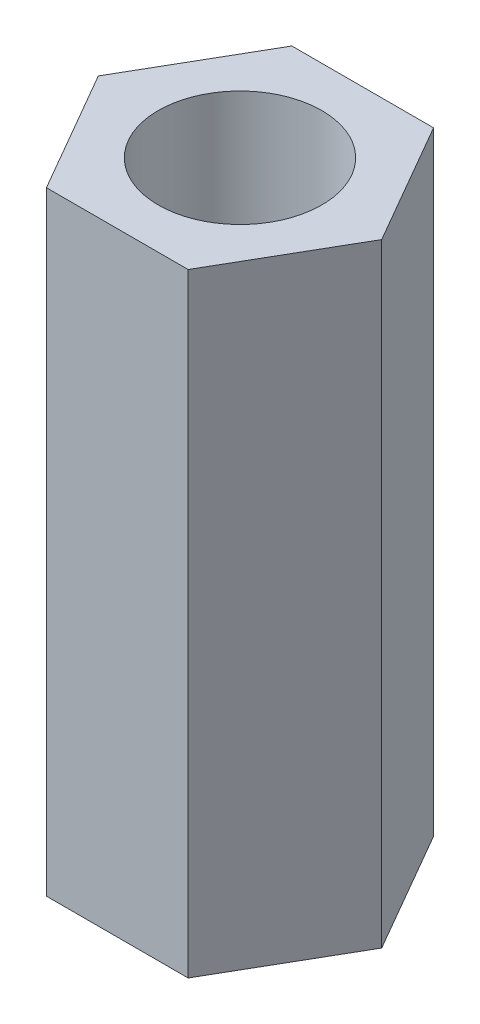
ISO-10303-21;
HEADER;
FILE_DESCRIPTION(('STEP AP214'),'2;1');
FILE_NAME('part.step','',(''),(''),'','','');
FILE_SCHEMA(('AUTOMOTIVE_DESIGN { 1 0 10303 214 1 1 1 1 }'));
ENDSEC;
DATA;
#1=APPLICATION_CONTEXT('core data for automotive mechanical design processes');
#2=APPLICATION_PROTOCOL_DEFINITION('international standard','automotive_design',2000,#1);
#3=PRODUCT_CONTEXT('',#1,'mechanical');
#4=PRODUCT('Part','Part','',(#3));
#5=PRODUCT_RELATED_PRODUCT_CATEGORY('part','',(#4));
#6=PRODUCT_DEFINITION_FORMATION('','',#4);
#7=PRODUCT_DEFINITION_CONTEXT('part definition',#1,'design');
#8=PRODUCT_DEFINITION('design','',#6,#7);
#9=PRODUCT_DEFINITION_SHAPE('','',#8);
#10=(LENGTH_UNIT() NAMED_UNIT(*) SI_UNIT(.MILLI.,.METRE.));
#11=(NAMED_UNIT(*) PLANE_ANGLE_UNIT() SI_UNIT($,.RADIAN.));
#12=(NAMED_UNIT(*) SI_UNIT($,.STERADIAN.) SOLID_ANGLE_UNIT());
#13=UNCERTAINTY_MEASURE_WITH_UNIT(LENGTH_MEASURE(1.E-05),#10,'distance_accuracy_value','');
#14=(GEOMETRIC_REPRESENTATION_CONTEXT(3) GLOBAL_UNCERTAINTY_ASSIGNED_CONTEXT((#13)) GLOBAL_UNIT_ASSIGNED_CONTEXT((#10,
#11,#12)) REPRESENTATION_CONTEXT('',''));
#15=CARTESIAN_POINT('',(0.,0.,0.));
#16=DIRECTION('',(0.,0.,1.));
#17=DIRECTION('',(1.,0.,0.));
#18=AXIS2_PLACEMENT_3D('',#15,#16,#17);
#19=CARTESIAN_POINT('',(1.732050808,0.,-3.));
#20=DIRECTION('',(-0.866025403855548,0.,0.499999999876834));
#21=DIRECTION('',(0.499999999876834,0.,0.866025403855548));
#22=AXIS2_PLACEMENT_3D('',#19,#20,#21);
#23=PLANE('',#22);
#24=DIRECTION('',(0.,1.,0.));
#25=VECTOR('',#24,1.);
#26=CARTESIAN_POINT('',(1.732050808,0.,-3.));
#27=LINE('',#26,#25);
#28=CARTESIAN_POINT('',(1.732050808,0.,-3.));
#29=VERTEX_POINT('',#28);
#30=CARTESIAN_POINT('',(1.732050808,15.,-3.));
#31=VERTEX_POINT('',#30);
#32=EDGE_CURVE('E22',#29,#31,#27,.T.);
#33=ORIENTED_EDGE('',*,*,#32,.T.);
#34=DIRECTION('',(-0.499999999876834,0.,-0.866025403855548));
#35=VECTOR('',#34,1.);
#36=CARTESIAN_POINT('',(3.46410161472361,15.,-4.78716025154036E-10));
#37=LINE('',#36,#35);
#38=CARTESIAN_POINT('',(3.464101615,15.,0.));
#39=VERTEX_POINT('',#38);
#40=EDGE_CURVE('E88',#39,#31,#37,.T.);
#41=ORIENTED_EDGE('',*,*,#40,.F.);
#42=DIRECTION('',(0.,1.,0.));
#43=VECTOR('',#42,1.);
#44=CARTESIAN_POINT('',(3.464101615,0.,0.));
#45=LINE('',#44,#43);
#46=CARTESIAN_POINT('',(3.464101615,0.,0.));
#47=VERTEX_POINT('',#46);
#48=EDGE_CURVE('E86',#39,#47,#45,.F.);
#49=ORIENTED_EDGE('',*,*,#48,.T.);
#50=DIRECTION('',(0.499999999876834,0.,0.866025403855548));
#51=VECTOR('',#50,1.);
#52=CARTESIAN_POINT('',(1.732050808,0.,-3.));
#53=LINE('',#52,#51);
#54=EDGE_CURVE('E73',#47,#29,#53,.F.);
#55=ORIENTED_EDGE('',*,*,#54,.T.);
#56=EDGE_LOOP('',(#33,#41,#49,#55));
#57=FACE_BOUND('',#56,.T.);
#58=ADVANCED_FACE('F17',(#57),#23,.F.);
#59=CARTESIAN_POINT('',(-1.732050808,0.,-3.));
#60=DIRECTION('',(0.,0.,1.));
#61=DIRECTION('',(1.,0.,0.));
#62=AXIS2_PLACEMENT_3D('',#59,#60,#61);
#63=PLANE('',#62);
#64=DIRECTION('',(0.,1.,0.));
#65=VECTOR('',#64,1.);
#66=CARTESIAN_POINT('',(-1.732050808,0.,-3.));
#67=LINE('',#66,#65);
#68=CARTESIAN_POINT('',(-1.732050808,0.,-3.));
#69=VERTEX_POINT('',#68);
#70=CARTESIAN_POINT('',(-1.732050808,15.,-3.));
#71=VERTEX_POINT('',#70);
#72=EDGE_CURVE('E145',#69,#71,#67,.T.);
#73=ORIENTED_EDGE('',*,*,#72,.T.);
#74=DIRECTION('',(1.,0.,0.));
#75=VECTOR('',#74,1.);
#76=CARTESIAN_POINT('',(-3.505670835,15.,-3.));
#77=LINE('',#76,#75);
#78=EDGE_CURVE('E129',#31,#71,#77,.F.);
#79=ORIENTED_EDGE('',*,*,#78,.F.);
#80=ORIENTED_EDGE('',*,*,#32,.F.);
#81=DIRECTION('',(1.,0.,0.));
#82=VECTOR('',#81,1.);
#83=CARTESIAN_POINT('',(-1.732050808,0.,-3.));
#84=LINE('',#83,#82);
#85=EDGE_CURVE('E79',#29,#69,#84,.F.);
#86=ORIENTED_EDGE('',*,*,#85,.T.);
#87=EDGE_LOOP('',(#73,#79,#80,#86));
#88=FACE_BOUND('',#87,.T.);
#89=ADVANCED_FACE('F155',(#88),#63,.F.);
#90=CARTESIAN_POINT('',(-3.464101615,0.,0.));
#91=DIRECTION('',(0.866025403855548,0.,0.499999999876834));
#92=DIRECTION('',(0.499999999876834,0.,-0.866025403855548));
#93=AXIS2_PLACEMENT_3D('',#90,#91,#92);
#94=PLANE('',#93);
#95=DIRECTION('',(0.,1.,0.));
#96=VECTOR('',#95,1.);
#97=CARTESIAN_POINT('',(-3.464101615,0.,0.));
#98=LINE('',#97,#96);
#99=CARTESIAN_POINT('',(-3.464101615,0.,0.));
#100=VERTEX_POINT('',#99);
#101=CARTESIAN_POINT('',(-3.464101615,15.,0.));
#102=VERTEX_POINT('',#101);
#103=EDGE_CURVE('E142',#100,#102,#98,.T.);
#104=ORIENTED_EDGE('',*,*,#103,.T.);
#105=DIRECTION('',(-0.499999999876834,0.,0.866025403855548));
#106=VECTOR('',#105,1.);
#107=CARTESIAN_POINT('',(-1.73205080773681,15.,-3.00000000045586));
#108=LINE('',#107,#106);
#109=EDGE_CURVE('E126',#71,#102,#108,.T.);
#110=ORIENTED_EDGE('',*,*,#109,.F.);
#111=ORIENTED_EDGE('',*,*,#72,.F.);
#112=DIRECTION('',(0.499999999876834,0.,-0.866025403855548));
#113=VECTOR('',#112,1.);
#114=CARTESIAN_POINT('',(-3.464101615,0.,0.));
#115=LINE('',#114,#113);
#116=EDGE_CURVE('E114',#69,#100,#115,.F.);
#117=ORIENTED_EDGE('',*,*,#116,.T.);
#118=EDGE_LOOP('',(#104,#110,#111,#117));
#119=FACE_BOUND('',#118,.T.);
#120=ADVANCED_FACE('F166',(#119),#94,.F.);
#121=CARTESIAN_POINT('',(-1.732050808,0.,3.));
#122=DIRECTION('',(0.866025403855548,0.,-0.499999999876834));
#123=DIRECTION('',(-0.499999999876834,0.,-0.866025403855548));
#124=AXIS2_PLACEMENT_3D('',#121,#122,#123);
#125=PLANE('',#124);
#126=DIRECTION('',(0.,1.,0.));
#127=VECTOR('',#126,1.);
#128=CARTESIAN_POINT('',(-1.732050808,0.,3.));
#129=LINE('',#128,#127);
#130=CARTESIAN_POINT('',(-1.732050808,0.,3.));
#131=VERTEX_POINT('',#130);
#132=CARTESIAN_POINT('',(-1.732050808,15.,3.));
#133=VERTEX_POINT('',#132);
#134=EDGE_CURVE('E138',#131,#133,#129,.T.);
#135=ORIENTED_EDGE('',*,*,#134,.T.);
#136=DIRECTION('',(0.499999999876834,0.,0.866025403855548));
#137=VECTOR('',#136,1.);
#138=CARTESIAN_POINT('',(-3.46410161472361,15.,4.78716025154036E-10));
#139=LINE('',#138,#137);
#140=EDGE_CURVE('E123',#102,#133,#139,.T.);
#141=ORIENTED_EDGE('',*,*,#140,.F.);
#142=ORIENTED_EDGE('',*,*,#103,.F.);
#143=DIRECTION('',(-0.499999999876834,0.,-0.866025403855548));
#144=VECTOR('',#143,1.);
#145=CARTESIAN_POINT('',(-1.732050808,0.,3.));
#146=LINE('',#145,#144);
#147=EDGE_CURVE('E104',#100,#131,#146,.F.);
#148=ORIENTED_EDGE('',*,*,#147,.T.);
#149=EDGE_LOOP('',(#135,#141,#142,#148));
#150=FACE_BOUND('',#149,.T.);
#151=ADVANCED_FACE('F164',(#150),#125,.F.);
#152=CARTESIAN_POINT('',(1.732050808,0.,3.));
#153=DIRECTION('',(0.,0.,-1.));
#154=DIRECTION('',(-1.,0.,0.));
#155=AXIS2_PLACEMENT_3D('',#152,#153,#154);
#156=PLANE('',#155);
#157=DIRECTION('',(0.,1.,0.));
#158=VECTOR('',#157,1.);
#159=CARTESIAN_POINT('',(1.732050808,0.,3.));
#160=LINE('',#159,#158);
#161=CARTESIAN_POINT('',(1.732050808,0.,3.));
#162=VERTEX_POINT('',#161);
#163=CARTESIAN_POINT('',(1.732050808,15.,3.));
#164=VERTEX_POINT('',#163);
#165=EDGE_CURVE('E38',#162,#164,#160,.T.);
#166=ORIENTED_EDGE('',*,*,#165,.T.);
#167=DIRECTION('',(1.,0.,0.));
#168=VECTOR('',#167,1.);
#169=CARTESIAN_POINT('',(-3.505670835,15.,3.));
#170=LINE('',#169,#168);
#171=EDGE_CURVE('E82',#133,#164,#170,.T.);
#172=ORIENTED_EDGE('',*,*,#171,.F.);
#173=ORIENTED_EDGE('',*,*,#134,.F.);
#174=DIRECTION('',(-1.,0.,0.));
#175=VECTOR('',#174,1.);
#176=CARTESIAN_POINT('',(1.732050808,0.,3.));
#177=LINE('',#176,#175);
#178=EDGE_CURVE('E95',#131,#162,#177,.F.);
#179=ORIENTED_EDGE('',*,*,#178,.T.);
#180=EDGE_LOOP('',(#166,#172,#173,#179));
#181=FACE_BOUND('',#180,.T.);
#182=ADVANCED_FACE('F161',(#181),#156,.F.);
#183=CARTESIAN_POINT('',(3.464101615,0.,0.));
#184=DIRECTION('',(-0.866025403855548,0.,-0.499999999876834));
#185=DIRECTION('',(-0.499999999876834,0.,0.866025403855548));
#186=AXIS2_PLACEMENT_3D('',#183,#184,#185);
#187=PLANE('',#186);
#188=ORIENTED_EDGE('',*,*,#48,.F.);
#189=DIRECTION('',(0.499999999876834,0.,-0.866025403855548));
#190=VECTOR('',#189,1.);
#191=CARTESIAN_POINT('',(1.73205080773681,15.,3.00000000045586));
#192=LINE('',#191,#190);
#193=EDGE_CURVE('E91',#164,#39,#192,.T.);
#194=ORIENTED_EDGE('',*,*,#193,.F.);
#195=ORIENTED_EDGE('',*,*,#165,.F.);
#196=DIRECTION('',(-0.499999999876834,0.,0.866025403855548));
#197=VECTOR('',#196,1.);
#198=CARTESIAN_POINT('',(3.464101615,0.,0.));
#199=LINE('',#198,#197);
#200=EDGE_CURVE('E76',#162,#47,#199,.F.);
#201=ORIENTED_EDGE('',*,*,#200,.T.);
#202=EDGE_LOOP('',(#188,#194,#195,#201));
#203=FACE_BOUND('',#202,.T.);
#204=ADVANCED_FACE('F93',(#203),#187,.F.);
#205=CARTESIAN_POINT('',(-3.505670835,15.,-3.));
#206=DIRECTION('',(0.,1.,0.));
#207=DIRECTION('',(0.,0.,1.));
#208=AXIS2_PLACEMENT_3D('',#205,#206,#207);
#209=PLANE('',#208);
#210=CARTESIAN_POINT('',(-1.19723388120618E-10,15.,-2.));
#211=CARTESIAN_POINT('',(-0.0561537282825787,15.,-1.99999966326123));
#212=CARTESIAN_POINT('',(-0.112317776617583,15.,-1.99763295356125));
#213=CARTESIAN_POINT('',(-0.224257742730536,15.,-1.98818150785587));
#214=CARTESIAN_POINT('',(-0.280033541006416,15.,-1.98109537894131));
#215=CARTESIAN_POINT('',(-0.390883816128431,15.,-1.96223695577142));
#216=CARTESIAN_POINT('',(-0.445957035799322,15.,-1.950457222763));
#217=CARTESIAN_POINT('',(-0.554945941310325,15.,-1.92229286464738));
#218=CARTESIAN_POINT('',(-0.608860649426699,15.,-1.90590450264052));
#219=CARTESIAN_POINT('',(-0.768058884950165,15.,-1.85005263952839));
#220=CARTESIAN_POINT('',(-0.871064439413996,15.,-1.80385648741787));
#221=CARTESIAN_POINT('',(-1.06784493792675,15.,-1.69480474605575));
#222=CARTESIAN_POINT('',(-1.16161953089511,15.,-1.63194852350822));
#223=CARTESIAN_POINT('',(-1.29332617529571,15.,-1.5265915317294));
#224=CARTESIAN_POINT('',(-1.33576066157836,15.,-1.48959927251656));
#225=CARTESIAN_POINT('',(-1.41732574908343,15.,-1.41221312952993));
#226=CARTESIAN_POINT('',(-1.45645949630214,15.,-1.37182255982206));
#227=CARTESIAN_POINT('',(-1.56856725646422,15.,-1.24587628298798));
#228=CARTESIAN_POINT('',(-1.63627627659007,15.,-1.15552317333004));
#229=CARTESIAN_POINT('',(-1.75552410747972,15.,-0.964781086284522));
#230=CARTESIAN_POINT('',(-1.80706352797462,15.,-0.864392487508325));
#231=CARTESIAN_POINT('',(-1.89256650045295,15.,-0.656376282856753));
#232=CARTESIAN_POINT('',(-1.92653024015285,15.,-0.5487487543104));
#233=CARTESIAN_POINT('',(-1.97590388958835,15.,-0.329321779905196));
#234=CARTESIAN_POINT('',(-1.9913137002381,15.,-0.217522311769704));
#235=CARTESIAN_POINT('',(-2.00314655628282,15.,0.00707692912882605));
#236=CARTESIAN_POINT('',(-1.99956960167778,15.,0.119876701891865));
#237=CARTESIAN_POINT('',(-1.97352600062362,15.,0.343276982105055));
#238=CARTESIAN_POINT('',(-1.95105945505258,15.,0.453877501296883));
#239=CARTESIAN_POINT('',(-1.88788753049189,15.,0.669726540320858));
#240=CARTESIAN_POINT('',(-1.84718195669945,15.,0.774975002976744));
#241=CARTESIAN_POINT('',(-1.7486368702934,15.,0.977191359603996));
#242=CARTESIAN_POINT('',(-1.69079671154076,15.,1.07415894112863));
#243=CARTESIAN_POINT('',(-1.59254362203355,15.,1.21118793418928));
#244=CARTESIAN_POINT('',(-1.55787063408007,15.,1.2554669608168));
#245=CARTESIAN_POINT('',(-1.48488858435554,15.,1.34099531309871));
#246=CARTESIAN_POINT('',(-1.44657604577215,15.,1.38224167360529));
#247=CARTESIAN_POINT('',(-1.32666911005668,15.,1.50085475325198));
#248=CARTESIAN_POINT('',(-1.24001838562408,15.,1.57321655916251));
#249=CARTESIAN_POINT('',(-1.05578607169728,15.,1.7023416976686));
#250=CARTESIAN_POINT('',(-0.9582048978849,15.,1.75910562316373));
#251=CARTESIAN_POINT('',(-0.805756713294285,15.,1.83137636289948));
#252=CARTESIAN_POINT('',(-0.753862511343682,15.,1.8533391943305));
#253=CARTESIAN_POINT('',(-0.648436383581057,15.,1.89279986053878));
#254=CARTESIAN_POINT('',(-0.594905822742257,15.,1.91030130879231));
#255=CARTESIAN_POINT('',(-0.486650790341392,15.,1.94070314391751));
#256=CARTESIAN_POINT('',(-0.431928350636566,15.,1.95361079626189));
#257=CARTESIAN_POINT('',(-0.321601203035078,15.,1.97477223150026));
#258=CARTESIAN_POINT('',(-0.265996760341601,15.,1.98302738703549));
#259=CARTESIAN_POINT('',(-0.175255113092285,15.,1.99261587204262));
#260=CARTESIAN_POINT('',(-0.140263192131721,15.,1.99538404364552));
#261=CARTESIAN_POINT('',(-0.0701821911749017,15.,1.99907621284032));
#262=CARTESIAN_POINT('',(-0.0350931111786462,15.,2.00000021043223));
#263=CARTESIAN_POINT('',(0.0561537276156468,15.,1.99999966327995));
#264=CARTESIAN_POINT('',(0.112317775951283,15.,1.99763295359871));
#265=CARTESIAN_POINT('',(0.224257742067113,15.,1.9881815079307));
#266=CARTESIAN_POINT('',(0.280033540345237,15.,1.98109537903477));
#267=CARTESIAN_POINT('',(0.390883815473597,15.,1.96223695590187));
#268=CARTESIAN_POINT('',(0.445957035148587,15.,1.95045722291179));
#269=CARTESIAN_POINT('',(0.554945940669289,15.,1.92229286483244));
#270=CARTESIAN_POINT('',(0.608860648791264,15.,1.90590450284352));
#271=CARTESIAN_POINT('',(0.768058884333474,15.,1.85005263978441));
#272=CARTESIAN_POINT('',(0.871064438812698,15.,1.80385648770824));
#273=CARTESIAN_POINT('',(1.0678449373618,15.,1.6948047464117));
#274=CARTESIAN_POINT('',(1.16161953035113,15.,1.63194852389543));
#275=CARTESIAN_POINT('',(1.29332617478684,15.,1.52659153216052));
#276=CARTESIAN_POINT('',(1.33576066108181,15.,1.48959927296182));
#277=CARTESIAN_POINT('',(1.41732574861266,15.,1.41221313000239));
#278=CARTESIAN_POINT('',(1.45645949584483,15.,1.37182256030757));
#279=CARTESIAN_POINT('',(1.5685672560489,15.,1.24587628351087));
#280=CARTESIAN_POINT('',(1.63627627620489,15.,1.15552317387548));
#281=CARTESIAN_POINT('',(1.75552410715813,15.,0.964781086869694));
#282=CARTESIAN_POINT('',(1.8070635276865,15.,0.864392488110673));
#283=CARTESIAN_POINT('',(1.89256650023416,15.,0.656376283487601));
#284=CARTESIAN_POINT('',(1.92653023996993,15.,0.548748754952573));
#285=CARTESIAN_POINT('',(1.97590388947858,15.,0.329321780563831));
#286=CARTESIAN_POINT('',(1.99131370016559,15.,0.217522312433477));
#287=CARTESIAN_POINT('',(2.00314655628517,15.,-0.00707692846110986));
#288=CARTESIAN_POINT('',(1.99956960171774,15.,-0.119876701225342));
#289=CARTESIAN_POINT('',(1.97352600073804,15.,-0.343276981447217));
#290=CARTESIAN_POINT('',(1.95105945520387,15.,-0.453877500646539));
#291=CARTESIAN_POINT('',(1.88788753071513,15.,-0.66972653969157));
#292=CARTESIAN_POINT('',(1.84718195695777,15.,-0.774975002361022));
#293=CARTESIAN_POINT('',(1.74863687061914,15.,-0.977191359021102));
#294=CARTESIAN_POINT('',(1.69079671189883,15.,-1.074158940565));
#295=CARTESIAN_POINT('',(1.5925436224373,15.,-1.21118793365839));
#296=CARTESIAN_POINT('',(1.55787063449858,15.,-1.25546696029749));
#297=CARTESIAN_POINT('',(1.48488858480255,15.,-1.34099531260374));
#298=CARTESIAN_POINT('',(1.4465760462329,15.,-1.38224167312309));
#299=CARTESIAN_POINT('',(1.32666911055697,15.,-1.50085475280975));
#300=CARTESIAN_POINT('',(1.24001838614849,15.,-1.57321655874916));
#301=CARTESIAN_POINT('',(1.05578607226473,15.,-1.70234169731666));
#302=CARTESIAN_POINT('',(0.958204898471274,15.,-1.75910562284432));
#303=CARTESIAN_POINT('',(0.805756713904871,15.,-1.83137636263083));
#304=CARTESIAN_POINT('',(0.753862511961722,15.,-1.8533391940791));
#305=CARTESIAN_POINT('',(0.648436384212554,15.,-1.89279986032244));
#306=CARTESIAN_POINT('',(0.594905823379758,15.,-1.91030130859377));
#307=CARTESIAN_POINT('',(0.48665079098909,15.,-1.9407031437551));
#308=CARTESIAN_POINT('',(0.431928351288452,15.,-1.95361079611776));
#309=CARTESIAN_POINT('',(0.321601203693752,15.,-1.974772231393));
#310=CARTESIAN_POINT('',(0.265996761002873,15.,-1.9830273869468));
#311=CARTESIAN_POINT('',(0.175255113535492,15.,-1.99261587200755));
#312=CARTESIAN_POINT('',(0.140263192353632,15.,-1.99538404363383));
#313=CARTESIAN_POINT('',(0.0701821909529897,15.,-1.99907621285201));
#314=CARTESIAN_POINT('',(0.0350931107342072,15.,-2.00000021044392));
#315=CARTESIAN_POINT('',(-1.19723388120618E-10,15.,-2.));
#316=B_SPLINE_CURVE_WITH_KNOTS('',3,(#210,#211,#212,#213,#214,#215,#216,#217,#218,#219,#220,
#221,#222,#223,#224,#225,#226,#227,#228,#229,#230,#231,#232,#233,#234,#235,#236,#237,#238,#239,
#240,#241,#242,#243,#244,#245,#246,#247,#248,#249,#250,#251,#252,#253,#254,#255,#256,#257,#258,
#259,#260,#261,#262,#263,#264,#265,#266,#267,#268,#269,#270,#271,#272,#273,#274,#275,#276,#277,
#278,#279,#280,#281,#282,#283,#284,#285,#286,#287,#288,#289,#290,#291,#292,#293,#294,#295,#296,
#297,#298,#299,#300,#301,#302,#303,#304,#305,#306,#307,#308,#309,#310,#311,#312,#313,#314,#315),
.UNSPECIFIED.,.T.,.F.,(4,2,2,2,2,2,2,2,2,2,2,2,2,2,2,2,2,2,2,2,2,2,2,2,2,2,2,2,2,2,2,2,2,2,2,2,
2,2,2,2,2,2,2,2,2,2,2,2,2,2,2,2,4),(0.,0.168428877456362,0.33690748775991,0.505654183695087,
0.674538104121825,1.01150089527945,1.34847649717352,1.51718508008366,1.68573100250976,
2.02271470724979,2.35968570331694,2.69665310030229,3.03362229682857,3.37059149335485,
3.70755889034019,4.04452988640734,4.38151359114743,4.5500595135735,4.71876809648362,
5.05574369837771,5.39270648953531,5.56159040996248,5.73033710589816,5.89881571620138,
6.06724459365714,6.17250373536567,6.2777628770742,6.44619175452996,6.61467036483318,
6.78341706076886,6.95230098119603,7.28926377235363,7.62623937424772,7.79494795715784,
7.96349387958391,8.300477584324,8.63744858039115,8.97441597737649,9.31138517390277,
9.64835437042905,9.9853217674144,10.3222927634815,10.6592764682216,10.8278223906477,
10.9965309735578,11.3335065754519,11.6704693666095,11.8393532870363,12.0080999829714,
12.176578593275,12.3450074707313,12.4502666131063,12.5555257554813),.UNSPECIFIED.);
#317=CARTESIAN_POINT('',(-1.19723388120618E-10,15.,-2.));
#318=VERTEX_POINT('',#317);
#319=EDGE_CURVE('E29',#318,#318,#316,.T.);
#320=ORIENTED_EDGE('',*,*,#319,.F.);
#321=EDGE_LOOP('',(#320));
#322=FACE_BOUND('',#321,.T.);
#323=ORIENTED_EDGE('',*,*,#140,.T.);
#324=ORIENTED_EDGE('',*,*,#171,.T.);
#325=ORIENTED_EDGE('',*,*,#193,.T.);
#326=ORIENTED_EDGE('',*,*,#40,.T.);
#327=ORIENTED_EDGE('',*,*,#78,.T.);
#328=ORIENTED_EDGE('',*,*,#109,.T.);
#329=EDGE_LOOP('',(#323,#324,#325,#326,#327,#328));
#330=FACE_BOUND('',#329,.T.);
#331=ADVANCED_FACE('F157',(#322,#330),#209,.T.);
#332=CARTESIAN_POINT('',(-3.505670835,0.,-3.));
#333=DIRECTION('',(0.,1.,0.));
#334=DIRECTION('',(0.,0.,1.));
#335=AXIS2_PLACEMENT_3D('',#332,#333,#334);
#336=PLANE('',#335);
#337=CARTESIAN_POINT('',(-5.46942690457236E-10,0.,2.));
#338=CARTESIAN_POINT('',(-0.0561537287097979,0.,1.99999966324924));
#339=CARTESIAN_POINT('',(-0.112317777044296,0.,1.99763295353726));
#340=CARTESIAN_POINT('',(-0.224257743155231,0.,1.98818150780797));
#341=CARTESIAN_POINT('',(-0.280033541429597,0.,1.9810953788815));
#342=CARTESIAN_POINT('',(-0.390883816547583,0.,1.96223695568792));
#343=CARTESIAN_POINT('',(-0.445957036215958,0.,1.95045722266774));
#344=CARTESIAN_POINT('',(-0.554945941720945,0.,1.92229286452883));
#345=CARTESIAN_POINT('',(-0.608860649833819,0.,1.90590450251046));
#346=CARTESIAN_POINT('',(-0.768058885345354,0.,1.85005263936433));
#347=CARTESIAN_POINT('',(-0.871064439799317,0.,1.80385648723181));
#348=CARTESIAN_POINT('',(-1.06784493828878,0.,1.69480474582764));
#349=CARTESIAN_POINT('',(-1.16161953124371,0.,1.63194852326009));
#350=CARTESIAN_POINT('',(-1.2933261756218,0.,1.52659153145313));
#351=CARTESIAN_POINT('',(-1.33576066189655,0.,1.48959927223123));
#352=CARTESIAN_POINT('',(-1.41732574938509,0.,1.41221312922717));
#353=CARTESIAN_POINT('',(-1.45645949659517,0.,1.37182255951094));
#354=CARTESIAN_POINT('',(-1.56856725673035,0.,1.24587628265292));
#355=CARTESIAN_POINT('',(-1.6362762768369,0.,1.15552317298052));
#356=CARTESIAN_POINT('',(-1.7555241076858,0.,0.964781085909526));
#357=CARTESIAN_POINT('',(-1.80706352815926,0.,0.86439248712232));
#358=CARTESIAN_POINT('',(-1.89256650059316,0.,0.656376282452483));
#359=CARTESIAN_POINT('',(-1.92653024027007,0.,0.548748753898875));
#360=CARTESIAN_POINT('',(-1.9759038896587,0.,0.329321779483125));
#361=CARTESIAN_POINT('',(-1.99131370028457,0.,0.217522311344341));
#362=CARTESIAN_POINT('',(-2.0031465562813,0.,-0.00707692955671774));
#363=CARTESIAN_POINT('',(-1.99956960165217,0.,-0.119876702318993));
#364=CARTESIAN_POINT('',(-1.97352600055029,0.,-0.34327698252662));
#365=CARTESIAN_POINT('',(-1.95105945495563,0.,-0.453877501713649));
#366=CARTESIAN_POINT('',(-1.88788753034883,0.,-0.66972654072413));
#367=CARTESIAN_POINT('',(-1.8471819565339,0.,-0.774975003371321));
#368=CARTESIAN_POINT('',(-1.74863687008466,0.,-0.977191359977522));
#369=CARTESIAN_POINT('',(-1.69079671131131,0.,-1.0741589414898));
#370=CARTESIAN_POINT('',(-1.59254362177482,0.,-1.21118793452946));
#371=CARTESIAN_POINT('',(-1.55787063381189,0.,-1.25546696114958));
#372=CARTESIAN_POINT('',(-1.48488858406909,0.,-1.3409953134159));
#373=CARTESIAN_POINT('',(-1.44657604547689,0.,-1.38224167391429));
#374=CARTESIAN_POINT('',(-1.32666910973608,0.,-1.50085475353537));
#375=CARTESIAN_POINT('',(-1.24001838528802,0.,-1.57321655942739));
#376=CARTESIAN_POINT('',(-1.05578607133364,0.,-1.70234169789413));
#377=CARTESIAN_POINT('',(-0.958204897509137,0.,-1.75910562336841));
#378=CARTESIAN_POINT('',(-0.805756712903085,0.,-1.8313763630716));
#379=CARTESIAN_POINT('',(-0.75386251094779,0.,-1.85333919449153));
#380=CARTESIAN_POINT('',(-0.648436383176736,0.,-1.89279986067729));
#381=CARTESIAN_POINT('',(-0.594905822334197,0.,-1.91030130891938));
#382=CARTESIAN_POINT('',(-0.486650789926838,0.,-1.94070314402146));
#383=CARTESIAN_POINT('',(-0.431928350219255,0.,-1.95361079635415));
#384=CARTESIAN_POINT('',(-0.321601202613246,0.,-1.97477223156896));
#385=CARTESIAN_POINT('',(-0.265996759918006,0.,-1.98302738709231));
#386=CARTESIAN_POINT('',(-0.175255112666642,0.,-1.99261587208005));
#387=CARTESIAN_POINT('',(-0.140263191705487,0.,-1.99538404367548));
#388=CARTESIAN_POINT('',(-0.0701821907478794,0.,-1.99907621285531));
#389=CARTESIAN_POINT('',(-0.0350931107514267,0.,-2.00000021043972));
#390=CARTESIAN_POINT('',(0.056153728042866,0.,-1.99999966326795));
#391=CARTESIAN_POINT('',(0.112317776377997,0.,-1.99763295357471));
#392=CARTESIAN_POINT('',(0.224257742491808,0.,-1.9881815078828));
#393=CARTESIAN_POINT('',(0.280033540768418,0.,-1.98109537897495));
#394=CARTESIAN_POINT('',(0.39088381589275,0.,-1.96223695581837));
#395=CARTESIAN_POINT('',(0.445957035565224,0.,-1.95045722281653));
#396=CARTESIAN_POINT('',(0.55494594107991,0.,-1.9222928647139));
#397=CARTESIAN_POINT('',(0.608860649198384,0.,-1.90590450271346));
#398=CARTESIAN_POINT('',(0.768058884728664,0.,-1.85005263962035));
#399=CARTESIAN_POINT('',(0.87106443919802,0.,-1.80385648752217));
#400=CARTESIAN_POINT('',(1.06784493772383,0.,-1.6948047461836));
#401=CARTESIAN_POINT('',(1.16161953069973,0.,-1.63194852364729));
#402=CARTESIAN_POINT('',(1.29332617511293,0.,-1.52659153188425));
#403=CARTESIAN_POINT('',(1.33576066140001,0.,-1.48959927267649));
#404=CARTESIAN_POINT('',(1.41732574891433,0.,-1.41221312969964));
#405=CARTESIAN_POINT('',(1.45645949613787,0.,-1.37182255999646));
#406=CARTESIAN_POINT('',(1.56856725631504,0.,-1.24587628317581));
#407=CARTESIAN_POINT('',(1.63627627645172,0.,-1.15552317352596));
#408=CARTESIAN_POINT('',(1.75552410736421,0.,-0.964781086494696));
#409=CARTESIAN_POINT('',(1.80706352787114,0.,-0.864392487724666));
#410=CARTESIAN_POINT('',(1.89256650037437,0.,-0.65637628308333));
#411=CARTESIAN_POINT('',(1.92653024008715,0.,-0.548748754541046));
#412=CARTESIAN_POINT('',(1.97590388954892,0.,-0.329321780141758));
#413=CARTESIAN_POINT('',(1.99131370021206,0.,-0.217522312008112));
#414=CARTESIAN_POINT('',(2.00314655628366,0.,0.00707692888900225));
#415=CARTESIAN_POINT('',(1.99956960169213,0.,0.119876701652471));
#416=CARTESIAN_POINT('',(1.97352600066472,0.,0.343276981868782));
#417=CARTESIAN_POINT('',(1.95105945510692,0.,0.453877501063304));
#418=CARTESIAN_POINT('',(1.88788753057207,0.,0.669726540094842));
#419=CARTESIAN_POINT('',(1.84718195679223,0.,0.774975002755598));
#420=CARTESIAN_POINT('',(1.7486368704104,0.,0.977191359394628));
#421=CARTESIAN_POINT('',(1.69079671166938,0.,1.07415894092618));
#422=CARTESIAN_POINT('',(1.59254362217858,0.,1.21118793399858));
#423=CARTESIAN_POINT('',(1.5578706342304,0.,1.25546696063026));
#424=CARTESIAN_POINT('',(1.4848885845161,0.,1.34099531292093));
#425=CARTESIAN_POINT('',(1.44657604593764,0.,1.38224167343209));
#426=CARTESIAN_POINT('',(1.32666911023637,0.,1.50085475309314));
#427=CARTESIAN_POINT('',(1.24001838581244,0.,1.57321655901404));
#428=CARTESIAN_POINT('',(1.0557860719011,0.,1.70234169754219));
#429=CARTESIAN_POINT('',(0.958204898095512,0.,1.75910562304901));
#430=CARTESIAN_POINT('',(0.805756713513671,0.,1.83137636280295));
#431=CARTESIAN_POINT('',(0.753862511565831,0.,1.85333919424014));
#432=CARTESIAN_POINT('',(0.648436383808233,0.,1.89279986046095));
#433=CARTESIAN_POINT('',(0.594905822971699,0.,1.91030130872085));
#434=CARTESIAN_POINT('',(0.486650790574537,0.,1.94070314385905));
#435=CARTESIAN_POINT('',(0.431928350871142,0.,1.95361079621003));
#436=CARTESIAN_POINT('',(0.321601203271921,0.,1.9747722314617));
#437=CARTESIAN_POINT('',(0.265996760579279,0.,1.98302738700362));
#438=CARTESIAN_POINT('',(0.175255113109849,0.,1.99261587204499));
#439=CARTESIAN_POINT('',(0.140263191927399,0.,1.99538404366379));
#440=CARTESIAN_POINT('',(0.0701821905259677,0.,1.99907621286701));
#441=CARTESIAN_POINT('',(0.0350931103069878,0.,2.00000021045142));
#442=CARTESIAN_POINT('',(-5.46942690457236E-10,0.,2.));
#443=B_SPLINE_CURVE_WITH_KNOTS('',3,(#337,#338,#339,#340,#341,#342,#343,#344,#345,#346,#347,
#348,#349,#350,#351,#352,#353,#354,#355,#356,#357,#358,#359,#360,#361,#362,#363,#364,#365,#366,
#367,#368,#369,#370,#371,#372,#373,#374,#375,#376,#377,#378,#379,#380,#381,#382,#383,#384,#385,
#386,#387,#388,#389,#390,#391,#392,#393,#394,#395,#396,#397,#398,#399,#400,#401,#402,#403,#404,
#405,#406,#407,#408,#409,#410,#411,#412,#413,#414,#415,#416,#417,#418,#419,#420,#421,#422,#423,
#424,#425,#426,#427,#428,#429,#430,#431,#432,#433,#434,#435,#436,#437,#438,#439,#440,#441,#442),
.UNSPECIFIED.,.T.,.F.,(4,2,2,2,2,2,2,2,2,2,2,2,2,2,2,2,2,2,2,2,2,2,2,2,2,2,2,2,2,2,2,2,2,2,2,2,
2,2,2,2,2,2,2,2,2,2,2,2,2,2,2,2,4),(0.,0.168428877456362,0.33690748775991,0.505654183695087,
0.674538104121825,1.01150089527945,1.34847649717352,1.51718508008366,1.68573100250976,
2.02271470724979,2.35968570331694,2.69665310030229,3.03362229682857,3.37059149335485,
3.70755889034019,4.04452988640734,4.38151359114743,4.5500595135735,4.71876809648362,
5.05574369837771,5.39270648953531,5.56159040996248,5.73033710589816,5.89881571620138,
6.06724459365714,6.17250373536567,6.2777628770742,6.44619175452996,6.61467036483318,
6.78341706076886,6.95230098119603,7.28926377235363,7.62623937424772,7.79494795715784,
7.96349387958391,8.300477584324,8.63744858039115,8.97441597737649,9.31138517390277,
9.64835437042905,9.9853217674144,10.3222927634815,10.6592764682216,10.8278223906477,
10.9965309735578,11.3335065754519,11.6704693666095,11.8393532870363,12.0080999829714,
12.176578593275,12.3450074707313,12.4502666131063,12.5555257554813),.UNSPECIFIED.);
#444=CARTESIAN_POINT('',(-5.46942690457236E-10,0.,2.));
#445=VERTEX_POINT('',#444);
#446=EDGE_CURVE('E11',#445,#445,#443,.T.);
#447=ORIENTED_EDGE('',*,*,#446,.F.);
#448=EDGE_LOOP('',(#447));
#449=FACE_BOUND('',#448,.T.);
#450=ORIENTED_EDGE('',*,*,#178,.F.);
#451=ORIENTED_EDGE('',*,*,#147,.F.);
#452=ORIENTED_EDGE('',*,*,#116,.F.);
#453=ORIENTED_EDGE('',*,*,#85,.F.);
#454=ORIENTED_EDGE('',*,*,#54,.F.);
#455=ORIENTED_EDGE('',*,*,#200,.F.);
#456=EDGE_LOOP('',(#450,#451,#452,#453,#454,#455));
#457=FACE_BOUND('',#456,.T.);
#458=ADVANCED_FACE('F19',(#449,#457),#336,.F.);
#459=CARTESIAN_POINT('',(0.,15.,-2.));
#460=CARTESIAN_POINT('',(0.,0.,-2.));
#461=(BOUNDED_CURVE() B_SPLINE_CURVE(1,(#459,#460),.UNSPECIFIED.,.F.,
.F.) B_SPLINE_CURVE_WITH_KNOTS((2,2),(0.,1.),
.UNSPECIFIED.) CURVE() GEOMETRIC_REPRESENTATION_ITEM() RATIONAL_B_SPLINE_CURVE((1.,1.)) REPRESENTATION_ITEM(''));
#462=CARTESIAN_POINT('',(0.,15.,0.));
#463=DIRECTION('',(0.,-1.,0.));
#464=AXIS1_PLACEMENT('',#462,#463);
#465=SURFACE_OF_REVOLUTION('',#461,#464);
#466=ORIENTED_EDGE('',*,*,#446,.T.);
#467=EDGE_LOOP('',(#466));
#468=FACE_BOUND('',#467,.T.);
#469=ORIENTED_EDGE('',*,*,#319,.T.);
#470=EDGE_LOOP('',(#469));
#471=FACE_BOUND('',#470,.T.);
#472=ADVANCED_FACE('F176',(#468,#471),#465,.F.);
#473=CLOSED_SHELL('',(#58,#89,#120,#151,#182,#204,#331,#458,#472));
#474=MANIFOLD_SOLID_BREP('B1',#473);
#475=ADVANCED_BREP_SHAPE_REPRESENTATION('',(#18,#474),#14);
#476=SHAPE_DEFINITION_REPRESENTATION(#9,#475);
ENDSEC;
END-ISO-10303-21;
